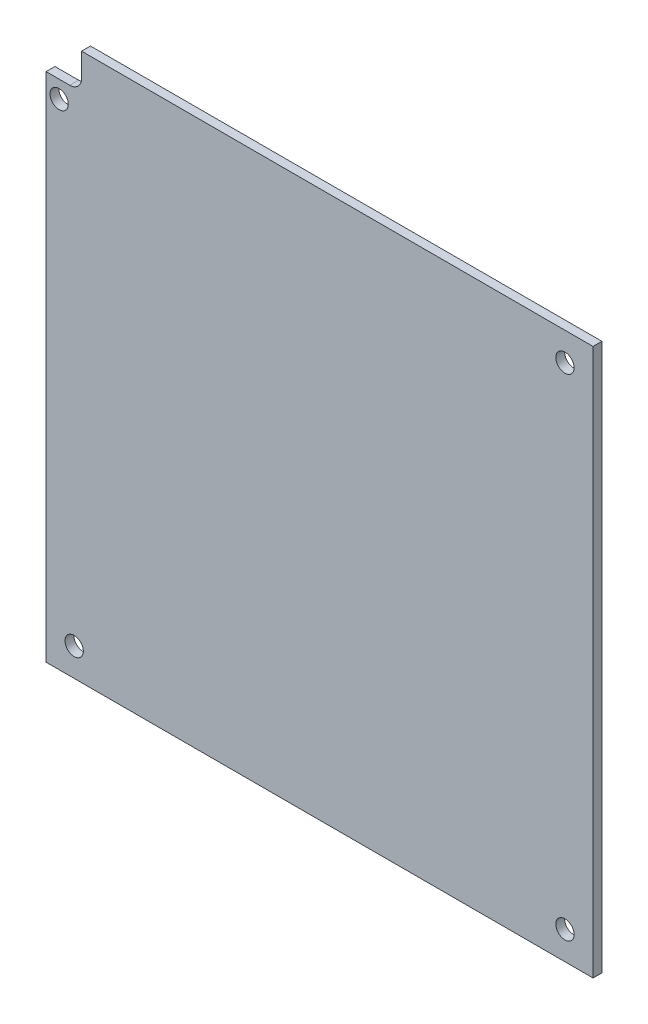
ISO-10303-21;
HEADER;
FILE_DESCRIPTION(('STEP AP214'),'2;1');
FILE_NAME('part.step','',(''),(''),'','','');
FILE_SCHEMA(('AUTOMOTIVE_DESIGN { 1 0 10303 214 1 1 1 1 }'));
ENDSEC;
DATA;
#1=APPLICATION_CONTEXT('core data for automotive mechanical design processes');
#2=APPLICATION_PROTOCOL_DEFINITION('international standard','automotive_design',2000,#1);
#3=PRODUCT_CONTEXT('',#1,'mechanical');
#4=PRODUCT('Part','Part','',(#3));
#5=PRODUCT_RELATED_PRODUCT_CATEGORY('part','',(#4));
#6=PRODUCT_DEFINITION_FORMATION('','',#4);
#7=PRODUCT_DEFINITION_CONTEXT('part definition',#1,'design');
#8=PRODUCT_DEFINITION('design','',#6,#7);
#9=PRODUCT_DEFINITION_SHAPE('','',#8);
#10=(LENGTH_UNIT() NAMED_UNIT(*) SI_UNIT(.MILLI.,.METRE.));
#11=(NAMED_UNIT(*) PLANE_ANGLE_UNIT() SI_UNIT($,.RADIAN.));
#12=(NAMED_UNIT(*) SI_UNIT($,.STERADIAN.) SOLID_ANGLE_UNIT());
#13=UNCERTAINTY_MEASURE_WITH_UNIT(LENGTH_MEASURE(1.E-05),#10,'distance_accuracy_value','');
#14=(GEOMETRIC_REPRESENTATION_CONTEXT(3) GLOBAL_UNCERTAINTY_ASSIGNED_CONTEXT((#13)) GLOBAL_UNIT_ASSIGNED_CONTEXT((#10,
#11,#12)) REPRESENTATION_CONTEXT('',''));
#15=CARTESIAN_POINT('',(0.,0.,0.));
#16=DIRECTION('',(0.,0.,1.));
#17=DIRECTION('',(1.,0.,0.));
#18=AXIS2_PLACEMENT_3D('',#15,#16,#17);
#19=CARTESIAN_POINT('',(-46.25,-46.25,1.5));
#20=DIRECTION('',(1.,0.,0.));
#21=DIRECTION('',(0.,0.,-1.));
#22=AXIS2_PLACEMENT_3D('',#19,#20,#21);
#23=PLANE('',#22);
#24=DIRECTION('',(0.,-1.,0.));
#25=VECTOR('',#24,1.);
#26=CARTESIAN_POINT('',(-46.25,-46.25,1.5));
#27=LINE('',#26,#25);
#28=CARTESIAN_POINT('',(-46.25,40.25,1.5));
#29=VERTEX_POINT('',#28);
#30=CARTESIAN_POINT('',(-46.25,-46.25,1.5));
#31=VERTEX_POINT('',#30);
#32=EDGE_CURVE('E80',#29,#31,#27,.T.);
#33=ORIENTED_EDGE('',*,*,#32,.F.);
#34=DIRECTION('',(0.,0.,-1.));
#35=VECTOR('',#34,1.);
#36=CARTESIAN_POINT('',(-46.25,40.25,10.));
#37=LINE('',#36,#35);
#38=CARTESIAN_POINT('',(-46.25,40.25,0.));
#39=VERTEX_POINT('',#38);
#40=EDGE_CURVE('E106',#29,#39,#37,.T.);
#41=ORIENTED_EDGE('',*,*,#40,.T.);
#42=DIRECTION('',(0.,-1.,0.));
#43=VECTOR('',#42,1.);
#44=CARTESIAN_POINT('',(-46.25,-46.25,0.));
#45=LINE('',#44,#43);
#46=CARTESIAN_POINT('',(-46.25,-46.25,0.));
#47=VERTEX_POINT('',#46);
#48=EDGE_CURVE('E114',#39,#47,#45,.T.);
#49=ORIENTED_EDGE('',*,*,#48,.T.);
#50=DIRECTION('',(0.,0.,-1.));
#51=VECTOR('',#50,1.);
#52=CARTESIAN_POINT('',(-46.25,-46.25,1.5));
#53=LINE('',#52,#51);
#54=EDGE_CURVE('E11',#31,#47,#53,.T.);
#55=ORIENTED_EDGE('',*,*,#54,.F.);
#56=EDGE_LOOP('',(#33,#41,#49,#55));
#57=FACE_BOUND('',#56,.T.);
#58=ADVANCED_FACE('F35',(#57),#23,.F.);
#59=CARTESIAN_POINT('',(46.25,-46.25,1.5));
#60=DIRECTION('',(0.,1.,0.));
#61=DIRECTION('',(-1.,0.,0.));
#62=AXIS2_PLACEMENT_3D('',#59,#60,#61);
#63=PLANE('',#62);
#64=DIRECTION('',(1.,0.,0.));
#65=VECTOR('',#64,1.);
#66=CARTESIAN_POINT('',(46.25,-46.25,0.));
#67=LINE('',#66,#65);
#68=CARTESIAN_POINT('',(46.25,-46.25,0.));
#69=VERTEX_POINT('',#68);
#70=EDGE_CURVE('E119',#47,#69,#67,.T.);
#71=ORIENTED_EDGE('',*,*,#70,.T.);
#72=DIRECTION('',(0.,0.,-1.));
#73=VECTOR('',#72,1.);
#74=CARTESIAN_POINT('',(46.25,-46.25,1.5));
#75=LINE('',#74,#73);
#76=CARTESIAN_POINT('',(46.25,-46.25,1.5));
#77=VERTEX_POINT('',#76);
#78=EDGE_CURVE('E42',#77,#69,#75,.T.);
#79=ORIENTED_EDGE('',*,*,#78,.F.);
#80=DIRECTION('',(1.,0.,0.));
#81=VECTOR('',#80,1.);
#82=CARTESIAN_POINT('',(46.25,-46.25,1.5));
#83=LINE('',#82,#81);
#84=EDGE_CURVE('E146',#31,#77,#83,.T.);
#85=ORIENTED_EDGE('',*,*,#84,.F.);
#86=ORIENTED_EDGE('',*,*,#54,.T.);
#87=EDGE_LOOP('',(#71,#79,#85,#86));
#88=FACE_BOUND('',#87,.T.);
#89=ADVANCED_FACE('F201',(#88),#63,.F.);
#90=CARTESIAN_POINT('',(46.25,-46.25,1.5));
#91=DIRECTION('',(-1.,0.,0.));
#92=DIRECTION('',(0.,0.,1.));
#93=AXIS2_PLACEMENT_3D('',#90,#91,#92);
#94=PLANE('',#93);
#95=DIRECTION('',(0.,1.,0.));
#96=VECTOR('',#95,1.);
#97=CARTESIAN_POINT('',(46.25,-46.25,0.));
#98=LINE('',#97,#96);
#99=CARTESIAN_POINT('',(46.25,46.25,0.));
#100=VERTEX_POINT('',#99);
#101=EDGE_CURVE('E75',#69,#100,#98,.T.);
#102=ORIENTED_EDGE('',*,*,#101,.T.);
#103=DIRECTION('',(0.,0.,-1.));
#104=VECTOR('',#103,1.);
#105=CARTESIAN_POINT('',(46.25,46.25,1.5));
#106=LINE('',#105,#104);
#107=CARTESIAN_POINT('',(46.25,46.25,1.5));
#108=VERTEX_POINT('',#107);
#109=EDGE_CURVE('E134',#108,#100,#106,.T.);
#110=ORIENTED_EDGE('',*,*,#109,.F.);
#111=DIRECTION('',(0.,1.,0.));
#112=VECTOR('',#111,1.);
#113=CARTESIAN_POINT('',(46.25,-46.25,1.5));
#114=LINE('',#113,#112);
#115=EDGE_CURVE('E58',#77,#108,#114,.T.);
#116=ORIENTED_EDGE('',*,*,#115,.F.);
#117=ORIENTED_EDGE('',*,*,#78,.T.);
#118=EDGE_LOOP('',(#102,#110,#116,#117));
#119=FACE_BOUND('',#118,.T.);
#120=ADVANCED_FACE('F136',(#119),#94,.F.);
#121=CARTESIAN_POINT('',(46.25,46.25,1.5));
#122=DIRECTION('',(0.,-1.,0.));
#123=DIRECTION('',(1.,0.,0.));
#124=AXIS2_PLACEMENT_3D('',#121,#122,#123);
#125=PLANE('',#124);
#126=DIRECTION('',(-1.,0.,0.));
#127=VECTOR('',#126,1.);
#128=CARTESIAN_POINT('',(46.25,46.25,0.));
#129=LINE('',#128,#127);
#130=CARTESIAN_POINT('',(-40.25,46.25,0.));
#131=VERTEX_POINT('',#130);
#132=EDGE_CURVE('E131',#100,#131,#129,.T.);
#133=ORIENTED_EDGE('',*,*,#132,.T.);
#134=DIRECTION('',(0.,0.,-1.));
#135=VECTOR('',#134,1.);
#136=CARTESIAN_POINT('',(-40.25,46.25,10.));
#137=LINE('',#136,#135);
#138=CARTESIAN_POINT('',(-40.25,46.25,1.5));
#139=VERTEX_POINT('',#138);
#140=EDGE_CURVE('E116',#139,#131,#137,.T.);
#141=ORIENTED_EDGE('',*,*,#140,.F.);
#142=DIRECTION('',(-1.,0.,0.));
#143=VECTOR('',#142,1.);
#144=CARTESIAN_POINT('',(46.25,46.25,1.5));
#145=LINE('',#144,#143);
#146=EDGE_CURVE('E127',#108,#139,#145,.T.);
#147=ORIENTED_EDGE('',*,*,#146,.F.);
#148=ORIENTED_EDGE('',*,*,#109,.T.);
#149=EDGE_LOOP('',(#133,#141,#147,#148));
#150=FACE_BOUND('',#149,.T.);
#151=ADVANCED_FACE('F143',(#150),#125,.F.);
#152=CARTESIAN_POINT('',(0.,0.,1.5));
#153=DIRECTION('',(0.,0.,1.));
#154=DIRECTION('',(1.,0.,0.));
#155=AXIS2_PLACEMENT_3D('',#152,#153,#154);
#156=PLANE('',#155);
#157=DIRECTION('',(0.,1.,0.));
#158=VECTOR('',#157,1.);
#159=CARTESIAN_POINT('',(-40.2500000000001,0.,1.5));
#160=LINE('',#159,#158);
#161=CARTESIAN_POINT('',(-40.25,42.25,1.5));
#162=VERTEX_POINT('',#161);
#163=EDGE_CURVE('E173',#162,#139,#160,.T.);
#164=ORIENTED_EDGE('',*,*,#163,.F.);
#165=CARTESIAN_POINT('',(-42.25,42.25,1.5));
#166=DIRECTION('',(0.,0.,1.));
#167=DIRECTION('',(1.,0.,0.));
#168=AXIS2_PLACEMENT_3D('',#165,#166,#167);
#169=CIRCLE('',#168,2.);
#170=CARTESIAN_POINT('',(-42.25,40.25,1.5));
#171=VERTEX_POINT('',#170);
#172=EDGE_CURVE('E170',#162,#171,#169,.F.);
#173=ORIENTED_EDGE('',*,*,#172,.T.);
#174=DIRECTION('',(1.,0.,0.));
#175=VECTOR('',#174,1.);
#176=CARTESIAN_POINT('',(0.,40.25,1.5));
#177=LINE('',#176,#175);
#178=EDGE_CURVE('E175',#29,#171,#177,.T.);
#179=ORIENTED_EDGE('',*,*,#178,.F.);
#180=ORIENTED_EDGE('',*,*,#32,.T.);
#181=ORIENTED_EDGE('',*,*,#84,.T.);
#182=ORIENTED_EDGE('',*,*,#115,.T.);
#183=ORIENTED_EDGE('',*,*,#146,.T.);
#184=EDGE_LOOP('',(#164,#173,#179,#180,#181,#182,#183));
#185=FACE_BOUND('',#184,.T.);
#186=CARTESIAN_POINT('',(-44.05,37.3280044424643,1.5));
#187=DIRECTION('',(0.,0.,1.));
#188=DIRECTION('',(1.,0.,0.));
#189=AXIS2_PLACEMENT_3D('',#186,#187,#188);
#190=CIRCLE('',#189,1.54999999999999);
#191=CARTESIAN_POINT('',(-42.5,37.3280044424643,1.5));
#192=VERTEX_POINT('',#191);
#193=EDGE_CURVE('E167',#192,#192,#190,.T.);
#194=ORIENTED_EDGE('',*,*,#193,.F.);
#195=EDGE_LOOP('',(#194));
#196=FACE_BOUND('',#195,.T.);
#197=CARTESIAN_POINT('',(41.5,41.5,1.5));
#198=DIRECTION('',(0.,0.,1.));
#199=DIRECTION('',(1.,0.,0.));
#200=AXIS2_PLACEMENT_3D('',#197,#198,#199);
#201=CIRCLE('',#200,1.54999999999999);
#202=CARTESIAN_POINT('',(43.05,41.5,1.5));
#203=VERTEX_POINT('',#202);
#204=EDGE_CURVE('E161',#203,#203,#201,.T.);
#205=ORIENTED_EDGE('',*,*,#204,.F.);
#206=EDGE_LOOP('',(#205));
#207=FACE_BOUND('',#206,.T.);
#208=CARTESIAN_POINT('',(41.5,-41.5,1.5));
#209=DIRECTION('',(0.,0.,1.));
#210=DIRECTION('',(1.,0.,0.));
#211=AXIS2_PLACEMENT_3D('',#208,#209,#210);
#212=CIRCLE('',#211,1.54999999999999);
#213=CARTESIAN_POINT('',(43.0499999999999,-41.5,1.5));
#214=VERTEX_POINT('',#213);
#215=EDGE_CURVE('E155',#214,#214,#212,.T.);
#216=ORIENTED_EDGE('',*,*,#215,.F.);
#217=EDGE_LOOP('',(#216));
#218=FACE_BOUND('',#217,.T.);
#219=CARTESIAN_POINT('',(-41.5,-41.5,1.5));
#220=DIRECTION('',(0.,0.,1.));
#221=DIRECTION('',(1.,0.,0.));
#222=AXIS2_PLACEMENT_3D('',#219,#220,#221);
#223=CIRCLE('',#222,1.54999999999999);
#224=CARTESIAN_POINT('',(-39.9500000000001,-41.5,1.5));
#225=VERTEX_POINT('',#224);
#226=EDGE_CURVE('E124',#225,#225,#223,.T.);
#227=ORIENTED_EDGE('',*,*,#226,.F.);
#228=EDGE_LOOP('',(#227));
#229=FACE_BOUND('',#228,.T.);
#230=ADVANCED_FACE('F185',(#185,#196,#207,#218,#229),#156,.T.);
#231=CARTESIAN_POINT('',(0.,0.,0.));
#232=DIRECTION('',(0.,0.,1.));
#233=DIRECTION('',(1.,0.,0.));
#234=AXIS2_PLACEMENT_3D('',#231,#232,#233);
#235=PLANE('',#234);
#236=CARTESIAN_POINT('',(-44.05,37.3280044424643,0.));
#237=DIRECTION('',(0.,0.,1.));
#238=DIRECTION('',(1.,0.,0.));
#239=AXIS2_PLACEMENT_3D('',#236,#237,#238);
#240=CIRCLE('',#239,1.55);
#241=CARTESIAN_POINT('',(-42.5,37.3280044424643,0.));
#242=VERTEX_POINT('',#241);
#243=EDGE_CURVE('E164',#242,#242,#240,.T.);
#244=ORIENTED_EDGE('',*,*,#243,.T.);
#245=EDGE_LOOP('',(#244));
#246=FACE_BOUND('',#245,.T.);
#247=CARTESIAN_POINT('',(41.5,41.5,0.));
#248=DIRECTION('',(0.,0.,1.));
#249=DIRECTION('',(1.,0.,0.));
#250=AXIS2_PLACEMENT_3D('',#247,#248,#249);
#251=CIRCLE('',#250,1.55);
#252=CARTESIAN_POINT('',(43.05,41.5,0.));
#253=VERTEX_POINT('',#252);
#254=EDGE_CURVE('E158',#253,#253,#251,.T.);
#255=ORIENTED_EDGE('',*,*,#254,.T.);
#256=EDGE_LOOP('',(#255));
#257=FACE_BOUND('',#256,.T.);
#258=CARTESIAN_POINT('',(41.5,-41.5,0.));
#259=DIRECTION('',(0.,0.,1.));
#260=DIRECTION('',(1.,0.,0.));
#261=AXIS2_PLACEMENT_3D('',#258,#259,#260);
#262=CIRCLE('',#261,1.55);
#263=CARTESIAN_POINT('',(43.05,-41.5,0.));
#264=VERTEX_POINT('',#263);
#265=EDGE_CURVE('E152',#264,#264,#262,.T.);
#266=ORIENTED_EDGE('',*,*,#265,.T.);
#267=EDGE_LOOP('',(#266));
#268=FACE_BOUND('',#267,.T.);
#269=CARTESIAN_POINT('',(-41.5,-41.5,0.));
#270=DIRECTION('',(0.,0.,1.));
#271=DIRECTION('',(1.,0.,0.));
#272=AXIS2_PLACEMENT_3D('',#269,#270,#271);
#273=CIRCLE('',#272,1.55);
#274=CARTESIAN_POINT('',(-39.95,-41.5,0.));
#275=VERTEX_POINT('',#274);
#276=EDGE_CURVE('E120',#275,#275,#273,.T.);
#277=ORIENTED_EDGE('',*,*,#276,.T.);
#278=EDGE_LOOP('',(#277));
#279=FACE_BOUND('',#278,.T.);
#280=CARTESIAN_POINT('',(-42.25,42.25,0.));
#281=DIRECTION('',(0.,0.,-1.));
#282=DIRECTION('',(-1.,0.,0.));
#283=AXIS2_PLACEMENT_3D('',#280,#281,#282);
#284=CIRCLE('',#283,2.);
#285=CARTESIAN_POINT('',(-42.25,40.25,0.));
#286=VERTEX_POINT('',#285);
#287=CARTESIAN_POINT('',(-40.25,42.25,0.));
#288=VERTEX_POINT('',#287);
#289=EDGE_CURVE('E49',#286,#288,#284,.F.);
#290=ORIENTED_EDGE('',*,*,#289,.T.);
#291=DIRECTION('',(0.,-1.,0.));
#292=VECTOR('',#291,1.);
#293=CARTESIAN_POINT('',(-40.2500000000001,0.,0.));
#294=LINE('',#293,#292);
#295=EDGE_CURVE('E110',#131,#288,#294,.T.);
#296=ORIENTED_EDGE('',*,*,#295,.F.);
#297=ORIENTED_EDGE('',*,*,#132,.F.);
#298=ORIENTED_EDGE('',*,*,#101,.F.);
#299=ORIENTED_EDGE('',*,*,#70,.F.);
#300=ORIENTED_EDGE('',*,*,#48,.F.);
#301=DIRECTION('',(-1.,0.,0.));
#302=VECTOR('',#301,1.);
#303=CARTESIAN_POINT('',(0.,40.25,0.));
#304=LINE('',#303,#302);
#305=EDGE_CURVE('E103',#286,#39,#304,.T.);
#306=ORIENTED_EDGE('',*,*,#305,.F.);
#307=EDGE_LOOP('',(#290,#296,#297,#298,#299,#300,#306));
#308=FACE_BOUND('',#307,.T.);
#309=ADVANCED_FACE('F118',(#246,#257,#268,#279,#308),#235,.F.);
#310=CARTESIAN_POINT('',(-41.5,-41.5,1.5));
#311=DIRECTION('',(0.,0.,1.));
#312=DIRECTION('',(1.,0.,0.));
#313=AXIS2_PLACEMENT_3D('',#310,#311,#312);
#314=CYLINDRICAL_SURFACE('',#313,1.55);
#315=ORIENTED_EDGE('',*,*,#276,.F.);
#316=EDGE_LOOP('',(#315));
#317=FACE_BOUND('',#316,.T.);
#318=ORIENTED_EDGE('',*,*,#226,.T.);
#319=EDGE_LOOP('',(#318));
#320=FACE_BOUND('',#319,.T.);
#321=ADVANCED_FACE('F214',(#317,#320),#314,.F.);
#322=CARTESIAN_POINT('',(41.5,-41.5,1.5));
#323=DIRECTION('',(0.,0.,1.));
#324=DIRECTION('',(1.,0.,0.));
#325=AXIS2_PLACEMENT_3D('',#322,#323,#324);
#326=CYLINDRICAL_SURFACE('',#325,1.55);
#327=ORIENTED_EDGE('',*,*,#265,.F.);
#328=EDGE_LOOP('',(#327));
#329=FACE_BOUND('',#328,.T.);
#330=ORIENTED_EDGE('',*,*,#215,.T.);
#331=EDGE_LOOP('',(#330));
#332=FACE_BOUND('',#331,.T.);
#333=ADVANCED_FACE('F220',(#329,#332),#326,.F.);
#334=CARTESIAN_POINT('',(41.5,41.5,1.5));
#335=DIRECTION('',(0.,0.,1.));
#336=DIRECTION('',(1.,0.,0.));
#337=AXIS2_PLACEMENT_3D('',#334,#335,#336);
#338=CYLINDRICAL_SURFACE('',#337,1.55);
#339=ORIENTED_EDGE('',*,*,#254,.F.);
#340=EDGE_LOOP('',(#339));
#341=FACE_BOUND('',#340,.T.);
#342=ORIENTED_EDGE('',*,*,#204,.T.);
#343=EDGE_LOOP('',(#342));
#344=FACE_BOUND('',#343,.T.);
#345=ADVANCED_FACE('F196',(#341,#344),#338,.F.);
#346=CARTESIAN_POINT('',(-44.05,37.3280044424643,1.5));
#347=DIRECTION('',(0.,0.,1.));
#348=DIRECTION('',(1.,0.,0.));
#349=AXIS2_PLACEMENT_3D('',#346,#347,#348);
#350=CYLINDRICAL_SURFACE('',#349,1.55);
#351=ORIENTED_EDGE('',*,*,#243,.F.);
#352=EDGE_LOOP('',(#351));
#353=FACE_BOUND('',#352,.T.);
#354=ORIENTED_EDGE('',*,*,#193,.T.);
#355=EDGE_LOOP('',(#354));
#356=FACE_BOUND('',#355,.T.);
#357=ADVANCED_FACE('F189',(#353,#356),#350,.F.);
#358=CARTESIAN_POINT('',(-42.25,42.25,10.));
#359=DIRECTION('',(0.,0.,-1.));
#360=DIRECTION('',(-1.,0.,0.));
#361=AXIS2_PLACEMENT_3D('',#358,#359,#360);
#362=CYLINDRICAL_SURFACE('',#361,2.);
#363=DIRECTION('',(0.,0.,-1.));
#364=VECTOR('',#363,1.);
#365=CARTESIAN_POINT('',(-40.25,42.25,10.));
#366=LINE('',#365,#364);
#367=EDGE_CURVE('E177',#162,#288,#366,.T.);
#368=ORIENTED_EDGE('',*,*,#367,.T.);
#369=ORIENTED_EDGE('',*,*,#289,.F.);
#370=DIRECTION('',(0.,0.,-1.));
#371=VECTOR('',#370,1.);
#372=CARTESIAN_POINT('',(-42.25,40.25,10.));
#373=LINE('',#372,#371);
#374=EDGE_CURVE('E107',#171,#286,#373,.T.);
#375=ORIENTED_EDGE('',*,*,#374,.F.);
#376=ORIENTED_EDGE('',*,*,#172,.F.);
#377=EDGE_LOOP('',(#368,#369,#375,#376));
#378=FACE_BOUND('',#377,.T.);
#379=ADVANCED_FACE('F187',(#378),#362,.F.);
#380=CARTESIAN_POINT('',(-40.2500000000001,0.,10.));
#381=DIRECTION('',(1.,0.,0.));
#382=DIRECTION('',(0.,1.,0.));
#383=AXIS2_PLACEMENT_3D('',#380,#381,#382);
#384=PLANE('',#383);
#385=ORIENTED_EDGE('',*,*,#163,.T.);
#386=ORIENTED_EDGE('',*,*,#140,.T.);
#387=ORIENTED_EDGE('',*,*,#295,.T.);
#388=ORIENTED_EDGE('',*,*,#367,.F.);
#389=EDGE_LOOP('',(#385,#386,#387,#388));
#390=FACE_BOUND('',#389,.T.);
#391=ADVANCED_FACE('F184',(#390),#384,.F.);
#392=CARTESIAN_POINT('',(0.,40.25,10.));
#393=DIRECTION('',(0.,-1.,0.));
#394=DIRECTION('',(0.,0.,-1.));
#395=AXIS2_PLACEMENT_3D('',#392,#393,#394);
#396=PLANE('',#395);
#397=ORIENTED_EDGE('',*,*,#178,.T.);
#398=ORIENTED_EDGE('',*,*,#374,.T.);
#399=ORIENTED_EDGE('',*,*,#305,.T.);
#400=ORIENTED_EDGE('',*,*,#40,.F.);
#401=EDGE_LOOP('',(#397,#398,#399,#400));
#402=FACE_BOUND('',#401,.T.);
#403=ADVANCED_FACE('F105',(#402),#396,.F.);
#404=CLOSED_SHELL('',(#58,#89,#120,#151,#230,#309,#321,#333,#345,#357,#379,#391,#403));
#405=MANIFOLD_SOLID_BREP('B2',#404);
#406=ADVANCED_BREP_SHAPE_REPRESENTATION('',(#18,#405),#14);
#407=SHAPE_DEFINITION_REPRESENTATION(#9,#406);
ENDSEC;
END-ISO-10303-21;
